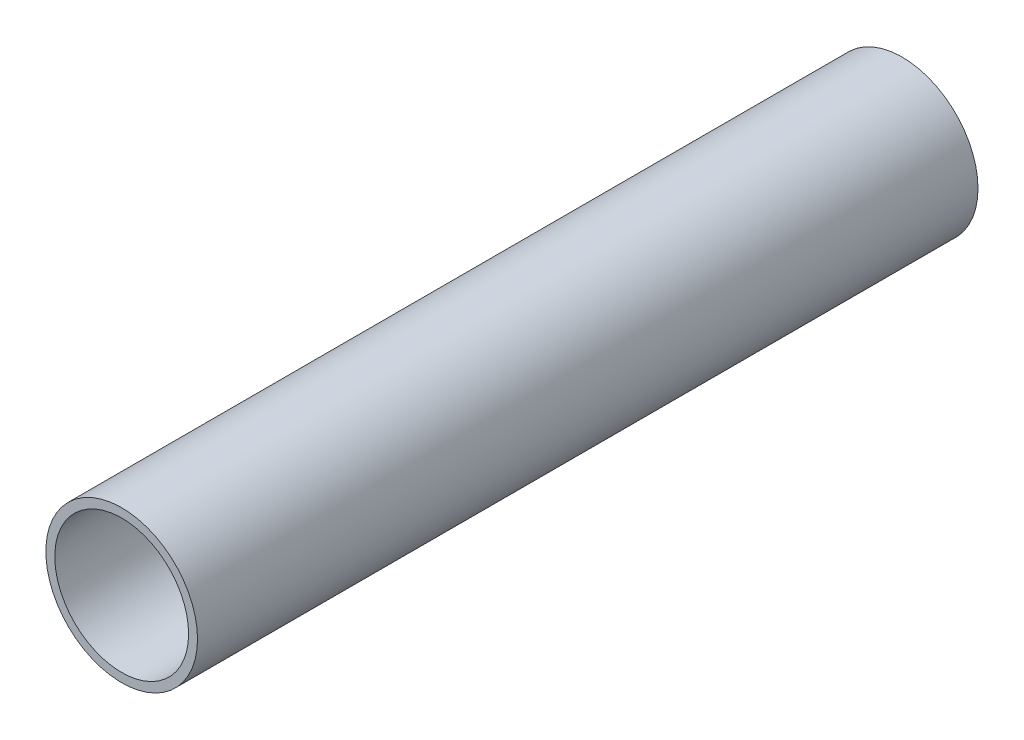
ISO-10303-21;
HEADER;
FILE_DESCRIPTION(('STEP AP214'),'2;1');
FILE_NAME('part.step','',(''),(''),'','','');
FILE_SCHEMA(('AUTOMOTIVE_DESIGN { 1 0 10303 214 1 1 1 1 }'));
ENDSEC;
DATA;
#1=APPLICATION_CONTEXT('core data for automotive mechanical design processes');
#2=APPLICATION_PROTOCOL_DEFINITION('international standard','automotive_design',2000,#1);
#3=PRODUCT_CONTEXT('',#1,'mechanical');
#4=PRODUCT('Part','Part','',(#3));
#5=PRODUCT_RELATED_PRODUCT_CATEGORY('part','',(#4));
#6=PRODUCT_DEFINITION_FORMATION('','',#4);
#7=PRODUCT_DEFINITION_CONTEXT('part definition',#1,'design');
#8=PRODUCT_DEFINITION('design','',#6,#7);
#9=PRODUCT_DEFINITION_SHAPE('','',#8);
#10=(LENGTH_UNIT() NAMED_UNIT(*) SI_UNIT(.MILLI.,.METRE.));
#11=(NAMED_UNIT(*) PLANE_ANGLE_UNIT() SI_UNIT($,.RADIAN.));
#12=(NAMED_UNIT(*) SI_UNIT($,.STERADIAN.) SOLID_ANGLE_UNIT());
#13=UNCERTAINTY_MEASURE_WITH_UNIT(LENGTH_MEASURE(1.E-05),#10,'distance_accuracy_value','');
#14=(GEOMETRIC_REPRESENTATION_CONTEXT(3) GLOBAL_UNCERTAINTY_ASSIGNED_CONTEXT((#13)) GLOBAL_UNIT_ASSIGNED_CONTEXT((#10,
#11,#12)) REPRESENTATION_CONTEXT('',''));
#15=CARTESIAN_POINT('',(0.,0.,0.));
#16=DIRECTION('',(0.,0.,1.));
#17=DIRECTION('',(1.,0.,0.));
#18=AXIS2_PLACEMENT_3D('',#15,#16,#17);
#19=CARTESIAN_POINT('',(0.,0.,87.5));
#20=DIRECTION('',(0.,0.,-1.));
#21=DIRECTION('',(-1.,0.,0.));
#22=AXIS2_PLACEMENT_3D('',#19,#20,#21);
#23=CYLINDRICAL_SURFACE('',#22,15.);
#24=CARTESIAN_POINT('',(0.,0.,87.5));
#25=DIRECTION('',(0.,0.,1.));
#26=DIRECTION('',(1.,0.,0.));
#27=AXIS2_PLACEMENT_3D('',#24,#25,#26);
#28=CIRCLE('',#27,15.);
#29=CARTESIAN_POINT('',(15.,0.,87.5));
#30=VERTEX_POINT('',#29);
#31=EDGE_CURVE('E40',#30,#30,#28,.T.);
#32=ORIENTED_EDGE('',*,*,#31,.T.);
#33=EDGE_LOOP('',(#32));
#34=FACE_BOUND('',#33,.T.);
#35=CARTESIAN_POINT('',(0.,0.,-87.5));
#36=DIRECTION('',(0.,0.,1.));
#37=DIRECTION('',(1.,0.,0.));
#38=AXIS2_PLACEMENT_3D('',#35,#36,#37);
#39=CIRCLE('',#38,15.);
#40=CARTESIAN_POINT('',(15.,0.,-87.5));
#41=VERTEX_POINT('',#40);
#42=EDGE_CURVE('E46',#41,#41,#39,.T.);
#43=ORIENTED_EDGE('',*,*,#42,.F.);
#44=EDGE_LOOP('',(#43));
#45=FACE_BOUND('',#44,.T.);
#46=ADVANCED_FACE('F33',(#34,#45),#23,.F.);
#47=CARTESIAN_POINT('',(0.,0.,87.5));
#48=DIRECTION('',(0.,0.,-1.));
#49=DIRECTION('',(-1.,0.,0.));
#50=AXIS2_PLACEMENT_3D('',#47,#48,#49);
#51=CYLINDRICAL_SURFACE('',#50,17.);
#52=CARTESIAN_POINT('',(0.,0.,87.5));
#53=DIRECTION('',(0.,0.,1.));
#54=DIRECTION('',(1.,0.,0.));
#55=AXIS2_PLACEMENT_3D('',#52,#53,#54);
#56=CIRCLE('',#55,17.);
#57=CARTESIAN_POINT('',(17.,0.,87.5));
#58=VERTEX_POINT('',#57);
#59=EDGE_CURVE('E10',#58,#58,#56,.T.);
#60=ORIENTED_EDGE('',*,*,#59,.F.);
#61=EDGE_LOOP('',(#60));
#62=FACE_BOUND('',#61,.T.);
#63=CARTESIAN_POINT('',(0.,0.,-87.5));
#64=DIRECTION('',(0.,0.,1.));
#65=DIRECTION('',(1.,0.,0.));
#66=AXIS2_PLACEMENT_3D('',#63,#64,#65);
#67=CIRCLE('',#66,17.);
#68=CARTESIAN_POINT('',(17.,0.,-87.5));
#69=VERTEX_POINT('',#68);
#70=EDGE_CURVE('E36',#69,#69,#67,.T.);
#71=ORIENTED_EDGE('',*,*,#70,.T.);
#72=EDGE_LOOP('',(#71));
#73=FACE_BOUND('',#72,.T.);
#74=ADVANCED_FACE('F53',(#62,#73),#51,.T.);
#75=CARTESIAN_POINT('',(0.,0.,87.5));
#76=DIRECTION('',(0.,0.,1.));
#77=DIRECTION('',(1.,0.,0.));
#78=AXIS2_PLACEMENT_3D('',#75,#76,#77);
#79=PLANE('',#78);
#80=ORIENTED_EDGE('',*,*,#31,.F.);
#81=EDGE_LOOP('',(#80));
#82=FACE_BOUND('',#81,.T.);
#83=ORIENTED_EDGE('',*,*,#59,.T.);
#84=EDGE_LOOP('',(#83));
#85=FACE_BOUND('',#84,.T.);
#86=ADVANCED_FACE('F57',(#82,#85),#79,.T.);
#87=CARTESIAN_POINT('',(0.,0.,-87.5));
#88=DIRECTION('',(0.,0.,1.));
#89=DIRECTION('',(1.,0.,0.));
#90=AXIS2_PLACEMENT_3D('',#87,#88,#89);
#91=PLANE('',#90);
#92=ORIENTED_EDGE('',*,*,#42,.T.);
#93=EDGE_LOOP('',(#92));
#94=FACE_BOUND('',#93,.T.);
#95=ORIENTED_EDGE('',*,*,#70,.F.);
#96=EDGE_LOOP('',(#95));
#97=FACE_BOUND('',#96,.T.);
#98=ADVANCED_FACE('F55',(#94,#97),#91,.F.);
#99=CLOSED_SHELL('',(#46,#74,#86,#98));
#100=MANIFOLD_SOLID_BREP('B2',#99);
#101=ADVANCED_BREP_SHAPE_REPRESENTATION('',(#18,#100),#14);
#102=SHAPE_DEFINITION_REPRESENTATION(#9,#101);
ENDSEC;
END-ISO-10303-21;
